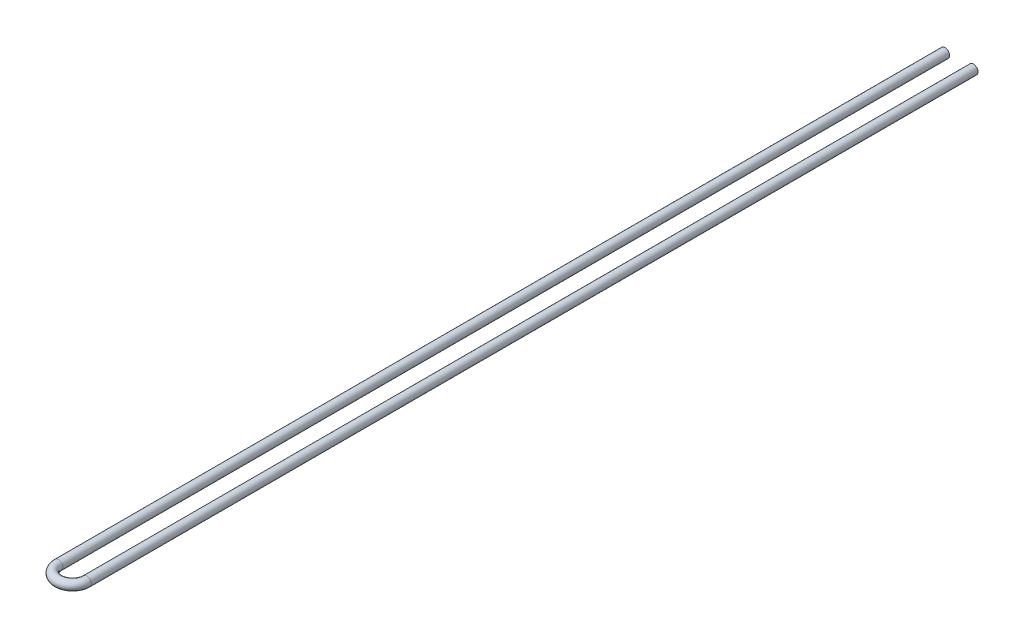
ISO-10303-21;
HEADER;
FILE_DESCRIPTION(('STEP AP214'),'2;1');
FILE_NAME('part.step','',(''),(''),'','','');
FILE_SCHEMA(('AUTOMOTIVE_DESIGN { 1 0 10303 214 1 1 1 1 }'));
ENDSEC;
DATA;
#1=APPLICATION_CONTEXT('core data for automotive mechanical design processes');
#2=APPLICATION_PROTOCOL_DEFINITION('international standard','automotive_design',2000,#1);
#3=PRODUCT_CONTEXT('',#1,'mechanical');
#4=PRODUCT('Part','Part','',(#3));
#5=PRODUCT_RELATED_PRODUCT_CATEGORY('part','',(#4));
#6=PRODUCT_DEFINITION_FORMATION('','',#4);
#7=PRODUCT_DEFINITION_CONTEXT('part definition',#1,'design');
#8=PRODUCT_DEFINITION('design','',#6,#7);
#9=PRODUCT_DEFINITION_SHAPE('','',#8);
#10=(LENGTH_UNIT() NAMED_UNIT(*) SI_UNIT(.MILLI.,.METRE.));
#11=(NAMED_UNIT(*) PLANE_ANGLE_UNIT() SI_UNIT($,.RADIAN.));
#12=(NAMED_UNIT(*) SI_UNIT($,.STERADIAN.) SOLID_ANGLE_UNIT());
#13=UNCERTAINTY_MEASURE_WITH_UNIT(LENGTH_MEASURE(1.E-05),#10,'distance_accuracy_value','');
#14=(GEOMETRIC_REPRESENTATION_CONTEXT(3) GLOBAL_UNCERTAINTY_ASSIGNED_CONTEXT((#13)) GLOBAL_UNIT_ASSIGNED_CONTEXT((#10,
#11,#12)) REPRESENTATION_CONTEXT('',''));
#15=CARTESIAN_POINT('',(0.,0.,0.));
#16=DIRECTION('',(0.,0.,1.));
#17=DIRECTION('',(1.,0.,0.));
#18=AXIS2_PLACEMENT_3D('',#15,#16,#17);
#19=CARTESIAN_POINT('',(-40.,0.,299.999999999999));
#20=DIRECTION('',(0.,0.,1.));
#21=DIRECTION('',(1.,0.,0.));
#22=AXIS2_PLACEMENT_3D('',#19,#20,#21);
#23=CYLINDRICAL_SURFACE('',#22,11.1);
#24=CARTESIAN_POINT('',(-39.9999999999997,0.,2440.));
#25=DIRECTION('',(0.,0.,1.));
#26=DIRECTION('',(1.,0.,0.));
#27=AXIS2_PLACEMENT_3D('',#24,#25,#26);
#28=CIRCLE('',#27,11.1);
#29=CARTESIAN_POINT('',(-51.0999999999997,0.,2440.));
#30=VERTEX_POINT('',#29);
#31=EDGE_CURVE('E54',#30,#30,#28,.T.);
#32=ORIENTED_EDGE('',*,*,#31,.F.);
#33=EDGE_LOOP('',(#32));
#34=FACE_BOUND('',#33,.T.);
#35=CARTESIAN_POINT('',(-40.,0.,299.999999999999));
#36=DIRECTION('',(0.,0.,1.));
#37=DIRECTION('',(1.,0.,0.));
#38=AXIS2_PLACEMENT_3D('',#35,#36,#37);
#39=CIRCLE('',#38,11.1);
#40=CARTESIAN_POINT('',(-28.9,0.,299.999999999999));
#41=VERTEX_POINT('',#40);
#42=EDGE_CURVE('E52',#41,#41,#39,.T.);
#43=ORIENTED_EDGE('',*,*,#42,.T.);
#44=EDGE_LOOP('',(#43));
#45=FACE_BOUND('',#44,.T.);
#46=ADVANCED_FACE('F31',(#34,#45),#23,.T.);
#47=CARTESIAN_POINT('',(-5.6899999999997,0.,2440.));
#48=DIRECTION('',(0.,1.,0.));
#49=DIRECTION('',(0.,0.,1.));
#50=AXIS2_PLACEMENT_3D('',#47,#48,#49);
#51=TOROIDAL_SURFACE('',#50,34.31,11.1);
#52=CARTESIAN_POINT('',(28.6200000000003,0.,2440.));
#53=DIRECTION('',(0.,0.,-1.));
#54=DIRECTION('',(-1.,0.,0.));
#55=AXIS2_PLACEMENT_3D('',#52,#53,#54);
#56=CIRCLE('',#55,11.1);
#57=CARTESIAN_POINT('',(39.7200000000003,0.,2440.));
#58=VERTEX_POINT('',#57);
#59=EDGE_CURVE('E35',#58,#58,#56,.T.);
#60=CARTESIAN_POINT('',(-5.6899999999997,0.,2440.));
#61=DIRECTION('',(0.,1.,0.));
#62=DIRECTION('',(0.,0.,1.));
#63=AXIS2_PLACEMENT_3D('',#60,#61,#62);
#64=CIRCLE('',#63,45.41);
#65=EDGE_CURVE('',#30,#58,#64,.T.);
#66=ORIENTED_EDGE('',*,*,#31,.T.);
#67=ORIENTED_EDGE('',*,*,#59,.F.);
#68=ORIENTED_EDGE('',*,*,#65,.T.);
#69=ORIENTED_EDGE('',*,*,#65,.F.);
#70=EDGE_LOOP('',(#66,#68,#67,#69));
#71=FACE_BOUND('',#70,.T.);
#72=ADVANCED_FACE('F62',(#71),#51,.T.);
#73=CARTESIAN_POINT('',(28.6200000000003,0.,2440.));
#74=DIRECTION('',(0.,0.,-1.));
#75=DIRECTION('',(-1.,0.,0.));
#76=AXIS2_PLACEMENT_3D('',#73,#74,#75);
#77=CYLINDRICAL_SURFACE('',#76,11.1);
#78=CARTESIAN_POINT('',(28.62,0.,299.999999999999));
#79=DIRECTION('',(0.,0.,-1.));
#80=DIRECTION('',(-1.,0.,0.));
#81=AXIS2_PLACEMENT_3D('',#78,#79,#80);
#82=CIRCLE('',#81,11.1);
#83=CARTESIAN_POINT('',(17.52,0.,299.999999999999));
#84=VERTEX_POINT('',#83);
#85=EDGE_CURVE('E48',#84,#84,#82,.T.);
#86=ORIENTED_EDGE('',*,*,#85,.F.);
#87=EDGE_LOOP('',(#86));
#88=FACE_BOUND('',#87,.T.);
#89=ORIENTED_EDGE('',*,*,#59,.T.);
#90=EDGE_LOOP('',(#89));
#91=FACE_BOUND('',#90,.T.);
#92=ADVANCED_FACE('F33',(#88,#91),#77,.T.);
#93=CARTESIAN_POINT('',(-40.,0.,299.999999999999));
#94=DIRECTION('',(0.,0.,1.));
#95=DIRECTION('',(1.,0.,0.));
#96=AXIS2_PLACEMENT_3D('',#93,#94,#95);
#97=PLANE('',#96);
#98=CARTESIAN_POINT('',(-40.,0.,299.999999999999));
#99=DIRECTION('',(0.,0.,1.));
#100=DIRECTION('',(1.,0.,0.));
#101=AXIS2_PLACEMENT_3D('',#98,#99,#100);
#102=CIRCLE('',#101,9.95);
#103=CARTESIAN_POINT('',(-30.05,0.,299.999999999999));
#104=VERTEX_POINT('',#103);
#105=EDGE_CURVE('E51',#104,#104,#102,.F.);
#106=ORIENTED_EDGE('',*,*,#105,.F.);
#107=EDGE_LOOP('',(#106));
#108=FACE_BOUND('',#107,.T.);
#109=ORIENTED_EDGE('',*,*,#42,.F.);
#110=EDGE_LOOP('',(#109));
#111=FACE_BOUND('',#110,.T.);
#112=ADVANCED_FACE('F68',(#108,#111),#97,.F.);
#113=CARTESIAN_POINT('',(28.62,0.,299.999999999999));
#114=DIRECTION('',(0.,0.,-1.));
#115=DIRECTION('',(-1.,0.,0.));
#116=AXIS2_PLACEMENT_3D('',#113,#114,#115);
#117=PLANE('',#116);
#118=CARTESIAN_POINT('',(28.62,0.,299.999999999999));
#119=DIRECTION('',(0.,0.,-1.));
#120=DIRECTION('',(-1.,0.,0.));
#121=AXIS2_PLACEMENT_3D('',#118,#119,#120);
#122=CIRCLE('',#121,9.95);
#123=CARTESIAN_POINT('',(18.67,0.,299.999999999999));
#124=VERTEX_POINT('',#123);
#125=EDGE_CURVE('E10',#124,#124,#122,.F.);
#126=ORIENTED_EDGE('',*,*,#125,.T.);
#127=EDGE_LOOP('',(#126));
#128=FACE_BOUND('',#127,.T.);
#129=ORIENTED_EDGE('',*,*,#85,.T.);
#130=EDGE_LOOP('',(#129));
#131=FACE_BOUND('',#130,.T.);
#132=ADVANCED_FACE('F86',(#128,#131),#117,.T.);
#133=CARTESIAN_POINT('',(-40.,0.,299.999999999999));
#134=DIRECTION('',(0.,0.,1.));
#135=DIRECTION('',(1.,0.,0.));
#136=AXIS2_PLACEMENT_3D('',#133,#134,#135);
#137=CYLINDRICAL_SURFACE('',#136,9.95);
#138=CARTESIAN_POINT('',(-39.9999999999997,0.,2440.));
#139=DIRECTION('',(0.,0.,1.));
#140=DIRECTION('',(1.,0.,0.));
#141=AXIS2_PLACEMENT_3D('',#138,#139,#140);
#142=CIRCLE('',#141,9.95);
#143=CARTESIAN_POINT('',(-49.9499999999997,0.,2440.));
#144=VERTEX_POINT('',#143);
#145=EDGE_CURVE('E44',#144,#144,#142,.F.);
#146=ORIENTED_EDGE('',*,*,#145,.F.);
#147=EDGE_LOOP('',(#146));
#148=FACE_BOUND('',#147,.T.);
#149=ORIENTED_EDGE('',*,*,#105,.T.);
#150=EDGE_LOOP('',(#149));
#151=FACE_BOUND('',#150,.T.);
#152=ADVANCED_FACE('F80',(#148,#151),#137,.F.);
#153=CARTESIAN_POINT('',(-5.6899999999997,0.,2440.));
#154=DIRECTION('',(0.,1.,0.));
#155=DIRECTION('',(0.,0.,1.));
#156=AXIS2_PLACEMENT_3D('',#153,#154,#155);
#157=TOROIDAL_SURFACE('',#156,34.31,9.95);
#158=CARTESIAN_POINT('',(28.6200000000003,0.,2440.));
#159=DIRECTION('',(0.,0.,-1.));
#160=DIRECTION('',(-1.,0.,0.));
#161=AXIS2_PLACEMENT_3D('',#158,#159,#160);
#162=CIRCLE('',#161,9.95);
#163=CARTESIAN_POINT('',(38.5700000000003,0.,2440.));
#164=VERTEX_POINT('',#163);
#165=EDGE_CURVE('E39',#164,#164,#162,.F.);
#166=CARTESIAN_POINT('',(-5.6899999999997,0.,2440.));
#167=DIRECTION('',(0.,1.,0.));
#168=DIRECTION('',(0.,0.,1.));
#169=AXIS2_PLACEMENT_3D('',#166,#167,#168);
#170=CIRCLE('',#169,44.26);
#171=EDGE_CURVE('',#144,#164,#170,.T.);
#172=ORIENTED_EDGE('',*,*,#145,.T.);
#173=ORIENTED_EDGE('',*,*,#165,.F.);
#174=ORIENTED_EDGE('',*,*,#171,.T.);
#175=ORIENTED_EDGE('',*,*,#171,.F.);
#176=EDGE_LOOP('',(#172,#174,#173,#175));
#177=FACE_BOUND('',#176,.T.);
#178=ADVANCED_FACE('F74',(#177),#157,.F.);
#179=CARTESIAN_POINT('',(28.6200000000003,0.,2440.));
#180=DIRECTION('',(0.,0.,-1.));
#181=DIRECTION('',(-1.,0.,0.));
#182=AXIS2_PLACEMENT_3D('',#179,#180,#181);
#183=CYLINDRICAL_SURFACE('',#182,9.95);
#184=ORIENTED_EDGE('',*,*,#125,.F.);
#185=EDGE_LOOP('',(#184));
#186=FACE_BOUND('',#185,.T.);
#187=ORIENTED_EDGE('',*,*,#165,.T.);
#188=EDGE_LOOP('',(#187));
#189=FACE_BOUND('',#188,.T.);
#190=ADVANCED_FACE('F72',(#186,#189),#183,.F.);
#191=CLOSED_SHELL('',(#46,#72,#92,#112,#132,#152,#178,#190));
#192=MANIFOLD_SOLID_BREP('B2',#191);
#193=ADVANCED_BREP_SHAPE_REPRESENTATION('',(#18,#192),#14);
#194=SHAPE_DEFINITION_REPRESENTATION(#9,#193);
ENDSEC;
END-ISO-10303-21;
